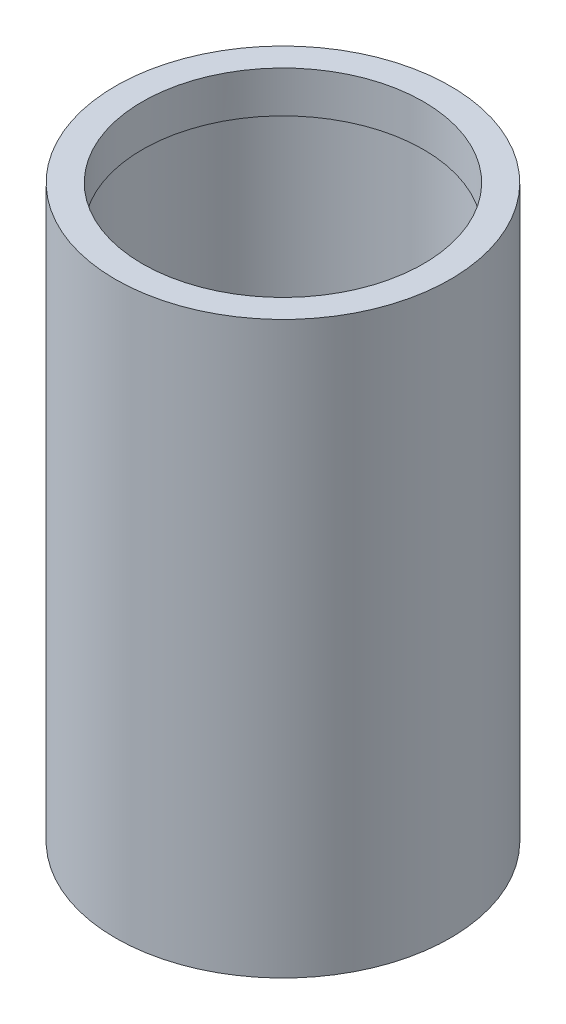
ISO-10303-21;
HEADER;
FILE_DESCRIPTION(('STEP AP214'),'2;1');
FILE_NAME('part.step','',(''),(''),'','','');
FILE_SCHEMA(('AUTOMOTIVE_DESIGN { 1 0 10303 214 1 1 1 1 }'));
ENDSEC;
DATA;
#1=APPLICATION_CONTEXT('core data for automotive mechanical design processes');
#2=APPLICATION_PROTOCOL_DEFINITION('international standard','automotive_design',2000,#1);
#3=PRODUCT_CONTEXT('',#1,'mechanical');
#4=PRODUCT('Part','Part','',(#3));
#5=PRODUCT_RELATED_PRODUCT_CATEGORY('part','',(#4));
#6=PRODUCT_DEFINITION_FORMATION('','',#4);
#7=PRODUCT_DEFINITION_CONTEXT('part definition',#1,'design');
#8=PRODUCT_DEFINITION('design','',#6,#7);
#9=PRODUCT_DEFINITION_SHAPE('','',#8);
#10=(LENGTH_UNIT() NAMED_UNIT(*) SI_UNIT(.MILLI.,.METRE.));
#11=(NAMED_UNIT(*) PLANE_ANGLE_UNIT() SI_UNIT($,.RADIAN.));
#12=(NAMED_UNIT(*) SI_UNIT($,.STERADIAN.) SOLID_ANGLE_UNIT());
#13=UNCERTAINTY_MEASURE_WITH_UNIT(LENGTH_MEASURE(1.E-05),#10,'distance_accuracy_value','');
#14=(GEOMETRIC_REPRESENTATION_CONTEXT(3) GLOBAL_UNCERTAINTY_ASSIGNED_CONTEXT((#13)) GLOBAL_UNIT_ASSIGNED_CONTEXT((#10,
#11,#12)) REPRESENTATION_CONTEXT('',''));
#15=CARTESIAN_POINT('',(0.,0.,0.));
#16=DIRECTION('',(0.,0.,1.));
#17=DIRECTION('',(1.,0.,0.));
#18=AXIS2_PLACEMENT_3D('',#15,#16,#17);
#19=CARTESIAN_POINT('',(0.,25.0952,0.));
#20=DIRECTION('',(0.,-1.,0.));
#21=DIRECTION('',(0.,0.,-1.));
#22=AXIS2_PLACEMENT_3D('',#19,#20,#21);
#23=CYLINDRICAL_SURFACE('',#22,4.3053);
#24=CARTESIAN_POINT('',(0.,17.4752,0.));
#25=DIRECTION('',(0.,1.,0.));
#26=DIRECTION('',(0.,0.,1.));
#27=AXIS2_PLACEMENT_3D('',#24,#25,#26);
#28=CIRCLE('',#27,4.3053);
#29=CARTESIAN_POINT('',(0.,17.4752,4.3053));
#30=VERTEX_POINT('',#29);
#31=EDGE_CURVE('E48',#30,#30,#28,.T.);
#32=ORIENTED_EDGE('',*,*,#31,.T.);
#33=EDGE_LOOP('',(#32));
#34=FACE_BOUND('',#33,.T.);
#35=CARTESIAN_POINT('',(0.,16.2052,0.));
#36=DIRECTION('',(0.,-1.,0.));
#37=DIRECTION('',(0.,0.,-1.));
#38=AXIS2_PLACEMENT_3D('',#35,#36,#37);
#39=CIRCLE('',#38,4.3053);
#40=CARTESIAN_POINT('',(0.,16.2052,-4.3053));
#41=VERTEX_POINT('',#40);
#42=EDGE_CURVE('E39',#41,#41,#39,.F.);
#43=ORIENTED_EDGE('',*,*,#42,.F.);
#44=EDGE_LOOP('',(#43));
#45=FACE_BOUND('',#44,.T.);
#46=ADVANCED_FACE('F35',(#34,#45),#23,.F.);
#47=CARTESIAN_POINT('',(0.,17.4752,0.));
#48=DIRECTION('',(0.,-1.,0.));
#49=DIRECTION('',(0.,0.,-1.));
#50=AXIS2_PLACEMENT_3D('',#47,#48,#49);
#51=CYLINDRICAL_SURFACE('',#50,5.1308);
#52=CARTESIAN_POINT('',(0.,17.4752,0.));
#53=DIRECTION('',(0.,1.,0.));
#54=DIRECTION('',(0.,0.,1.));
#55=AXIS2_PLACEMENT_3D('',#52,#53,#54);
#56=CIRCLE('',#55,5.1308);
#57=CARTESIAN_POINT('',(0.,17.4752,5.1308));
#58=VERTEX_POINT('',#57);
#59=EDGE_CURVE('E10',#58,#58,#56,.T.);
#60=ORIENTED_EDGE('',*,*,#59,.F.);
#61=EDGE_LOOP('',(#60));
#62=FACE_BOUND('',#61,.T.);
#63=CARTESIAN_POINT('',(0.,0.,0.));
#64=DIRECTION('',(0.,1.,0.));
#65=DIRECTION('',(0.,0.,1.));
#66=AXIS2_PLACEMENT_3D('',#63,#64,#65);
#67=CIRCLE('',#66,5.1308);
#68=CARTESIAN_POINT('',(0.,0.,5.1308));
#69=VERTEX_POINT('',#68);
#70=EDGE_CURVE('E43',#69,#69,#67,.T.);
#71=ORIENTED_EDGE('',*,*,#70,.T.);
#72=EDGE_LOOP('',(#71));
#73=FACE_BOUND('',#72,.T.);
#74=ADVANCED_FACE('F37',(#62,#73),#51,.T.);
#75=CARTESIAN_POINT('',(0.,17.4752,0.));
#76=DIRECTION('',(0.,1.,0.));
#77=DIRECTION('',(0.,0.,1.));
#78=AXIS2_PLACEMENT_3D('',#75,#76,#77);
#79=PLANE('',#78);
#80=ORIENTED_EDGE('',*,*,#31,.F.);
#81=EDGE_LOOP('',(#80));
#82=FACE_BOUND('',#81,.T.);
#83=ORIENTED_EDGE('',*,*,#59,.T.);
#84=EDGE_LOOP('',(#83));
#85=FACE_BOUND('',#84,.T.);
#86=ADVANCED_FACE('F70',(#82,#85),#79,.T.);
#87=CARTESIAN_POINT('',(0.,0.,0.));
#88=DIRECTION('',(0.,1.,0.));
#89=DIRECTION('',(0.,0.,1.));
#90=AXIS2_PLACEMENT_3D('',#87,#88,#89);
#91=PLANE('',#90);
#92=CARTESIAN_POINT('',(0.,0.,0.));
#93=DIRECTION('',(0.,-1.,0.));
#94=DIRECTION('',(0.,0.,-1.));
#95=AXIS2_PLACEMENT_3D('',#92,#93,#94);
#96=CIRCLE('',#95,4.36626);
#97=CARTESIAN_POINT('',(0.,0.,-4.36626));
#98=VERTEX_POINT('',#97);
#99=EDGE_CURVE('E52',#98,#98,#96,.T.);
#100=ORIENTED_EDGE('',*,*,#99,.F.);
#101=EDGE_LOOP('',(#100));
#102=FACE_BOUND('',#101,.T.);
#103=ORIENTED_EDGE('',*,*,#70,.F.);
#104=EDGE_LOOP('',(#103));
#105=FACE_BOUND('',#104,.T.);
#106=ADVANCED_FACE('F77',(#102,#105),#91,.F.);
#107=CARTESIAN_POINT('',(0.,16.2052,0.));
#108=DIRECTION('',(0.,-1.,0.));
#109=DIRECTION('',(0.,0.,-1.));
#110=AXIS2_PLACEMENT_3D('',#107,#108,#109);
#111=PLANE('',#110);
#112=CARTESIAN_POINT('',(0.,16.2052,0.));
#113=DIRECTION('',(0.,-1.,0.));
#114=DIRECTION('',(0.,0.,-1.));
#115=AXIS2_PLACEMENT_3D('',#112,#113,#114);
#116=CIRCLE('',#115,4.36626);
#117=CARTESIAN_POINT('',(0.,16.2052,-4.36626));
#118=VERTEX_POINT('',#117);
#119=EDGE_CURVE('E55',#118,#118,#116,.T.);
#120=ORIENTED_EDGE('',*,*,#119,.T.);
#121=EDGE_LOOP('',(#120));
#122=FACE_BOUND('',#121,.T.);
#123=ORIENTED_EDGE('',*,*,#42,.T.);
#124=EDGE_LOOP('',(#123));
#125=FACE_BOUND('',#124,.T.);
#126=ADVANCED_FACE('F62',(#122,#125),#111,.T.);
#127=CARTESIAN_POINT('',(0.,16.2052,0.));
#128=DIRECTION('',(0.,-1.,0.));
#129=DIRECTION('',(0.,0.,-1.));
#130=AXIS2_PLACEMENT_3D('',#127,#128,#129);
#131=CYLINDRICAL_SURFACE('',#130,4.36626);
#132=ORIENTED_EDGE('',*,*,#119,.F.);
#133=EDGE_LOOP('',(#132));
#134=FACE_BOUND('',#133,.T.);
#135=ORIENTED_EDGE('',*,*,#99,.T.);
#136=EDGE_LOOP('',(#135));
#137=FACE_BOUND('',#136,.T.);
#138=ADVANCED_FACE('F74',(#134,#137),#131,.F.);
#139=CLOSED_SHELL('',(#46,#74,#86,#106,#126,#138));
#140=MANIFOLD_SOLID_BREP('B2',#139);
#141=ADVANCED_BREP_SHAPE_REPRESENTATION('',(#18,#140),#14);
#142=SHAPE_DEFINITION_REPRESENTATION(#9,#141);
ENDSEC;
END-ISO-10303-21;
